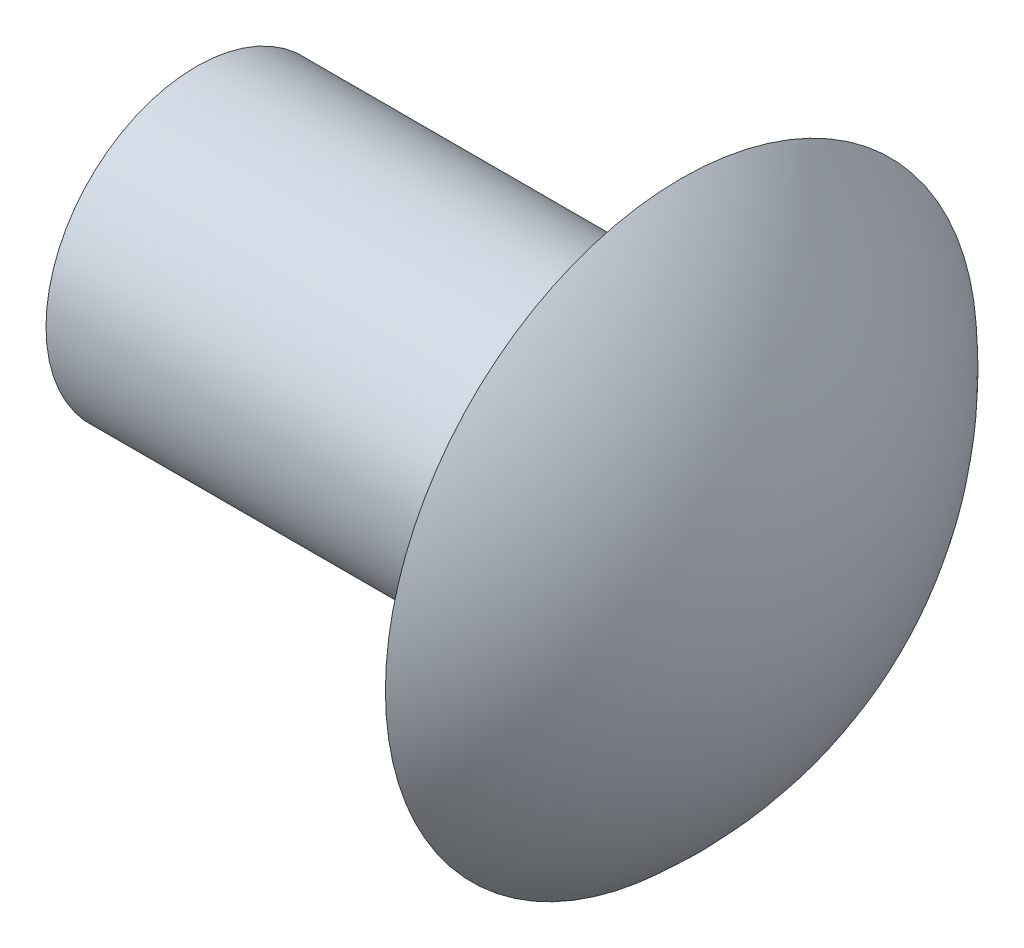
ISO-10303-21;
HEADER;
FILE_DESCRIPTION(('STEP AP214'),'2;1');
FILE_NAME('part.step','',(''),(''),'','','');
FILE_SCHEMA(('AUTOMOTIVE_DESIGN { 1 0 10303 214 1 1 1 1 }'));
ENDSEC;
DATA;
#1=APPLICATION_CONTEXT('core data for automotive mechanical design processes');
#2=APPLICATION_PROTOCOL_DEFINITION('international standard','automotive_design',2000,#1);
#3=PRODUCT_CONTEXT('',#1,'mechanical');
#4=PRODUCT('Part','Part','',(#3));
#5=PRODUCT_RELATED_PRODUCT_CATEGORY('part','',(#4));
#6=PRODUCT_DEFINITION_FORMATION('','',#4);
#7=PRODUCT_DEFINITION_CONTEXT('part definition',#1,'design');
#8=PRODUCT_DEFINITION('design','',#6,#7);
#9=PRODUCT_DEFINITION_SHAPE('','',#8);
#10=(LENGTH_UNIT() NAMED_UNIT(*) SI_UNIT(.MILLI.,.METRE.));
#11=(NAMED_UNIT(*) PLANE_ANGLE_UNIT() SI_UNIT($,.RADIAN.));
#12=(NAMED_UNIT(*) SI_UNIT($,.STERADIAN.) SOLID_ANGLE_UNIT());
#13=UNCERTAINTY_MEASURE_WITH_UNIT(LENGTH_MEASURE(1.E-05),#10,'distance_accuracy_value','');
#14=(GEOMETRIC_REPRESENTATION_CONTEXT(3) GLOBAL_UNCERTAINTY_ASSIGNED_CONTEXT((#13)) GLOBAL_UNIT_ASSIGNED_CONTEXT((#10,
#11,#12)) REPRESENTATION_CONTEXT('',''));
#15=CARTESIAN_POINT('',(0.,0.,0.));
#16=DIRECTION('',(0.,0.,1.));
#17=DIRECTION('',(1.,0.,0.));
#18=AXIS2_PLACEMENT_3D('',#15,#16,#17);
#19=CARTESIAN_POINT('',(-2.7,0.,0.));
#20=DIRECTION('',(1.,0.,0.));
#21=DIRECTION('',(0.,-1.,0.));
#22=AXIS2_PLACEMENT_3D('',#19,#20,#21);
#23=SPHERICAL_SURFACE('',#22,4.07338925220755);
#24=CARTESIAN_POINT('',(0.,0.,0.));
#25=DIRECTION('',(1.,0.,0.));
#26=DIRECTION('',(0.,1.,0.));
#27=AXIS2_PLACEMENT_3D('',#24,#25,#26);
#28=CIRCLE('',#27,3.05);
#29=CARTESIAN_POINT('',(0.,3.05,0.));
#30=VERTEX_POINT('',#29);
#31=EDGE_CURVE('E47',#30,#30,#28,.T.);
#32=ORIENTED_EDGE('',*,*,#31,.T.);
#33=EDGE_LOOP('',(#32));
#34=FACE_BOUND('',#33,.T.);
#35=ADVANCED_FACE('F37',(#34),#23,.T.);
#36=CARTESIAN_POINT('',(-5.,0.,0.));
#37=DIRECTION('',(1.,0.,0.));
#38=DIRECTION('',(0.,1.,0.));
#39=AXIS2_PLACEMENT_3D('',#36,#37,#38);
#40=PLANE('',#39);
#41=CARTESIAN_POINT('',(-5.,0.,0.));
#42=DIRECTION('',(1.,0.,0.));
#43=DIRECTION('',(0.,1.,0.));
#44=AXIS2_PLACEMENT_3D('',#41,#42,#43);
#45=CIRCLE('',#44,1.55);
#46=CARTESIAN_POINT('',(-5.,1.55,0.));
#47=VERTEX_POINT('',#46);
#48=EDGE_CURVE('E10',#47,#47,#45,.T.);
#49=ORIENTED_EDGE('',*,*,#48,.F.);
#50=EDGE_LOOP('',(#49));
#51=FACE_BOUND('',#50,.T.);
#52=ADVANCED_FACE('F62',(#51),#40,.F.);
#53=CARTESIAN_POINT('',(0.,0.,0.));
#54=DIRECTION('',(1.,0.,0.));
#55=DIRECTION('',(0.,1.,0.));
#56=AXIS2_PLACEMENT_3D('',#53,#54,#55);
#57=CYLINDRICAL_SURFACE('',#56,1.55);
#58=CARTESIAN_POINT('',(0.,0.,0.));
#59=DIRECTION('',(1.,0.,0.));
#60=DIRECTION('',(0.,1.,0.));
#61=AXIS2_PLACEMENT_3D('',#58,#59,#60);
#62=CIRCLE('',#61,1.55);
#63=CARTESIAN_POINT('',(0.,1.55,0.));
#64=VERTEX_POINT('',#63);
#65=EDGE_CURVE('E43',#64,#64,#62,.T.);
#66=ORIENTED_EDGE('',*,*,#65,.F.);
#67=EDGE_LOOP('',(#66));
#68=FACE_BOUND('',#67,.T.);
#69=ORIENTED_EDGE('',*,*,#48,.T.);
#70=EDGE_LOOP('',(#69));
#71=FACE_BOUND('',#70,.T.);
#72=ADVANCED_FACE('F57',(#68,#71),#57,.T.);
#73=CARTESIAN_POINT('',(0.,-1.55,0.));
#74=DIRECTION('',(1.,0.,0.));
#75=DIRECTION('',(0.,1.,0.));
#76=AXIS2_PLACEMENT_3D('',#73,#74,#75);
#77=PLANE('',#76);
#78=ORIENTED_EDGE('',*,*,#31,.F.);
#79=EDGE_LOOP('',(#78));
#80=FACE_BOUND('',#79,.T.);
#81=ORIENTED_EDGE('',*,*,#65,.T.);
#82=EDGE_LOOP('',(#81));
#83=FACE_BOUND('',#82,.T.);
#84=ADVANCED_FACE('F55',(#80,#83),#77,.F.);
#85=CLOSED_SHELL('',(#35,#52,#72,#84));
#86=MANIFOLD_SOLID_BREP('B2',#85);
#87=ADVANCED_BREP_SHAPE_REPRESENTATION('',(#18,#86),#14);
#88=SHAPE_DEFINITION_REPRESENTATION(#9,#87);
ENDSEC;
END-ISO-10303-21;
